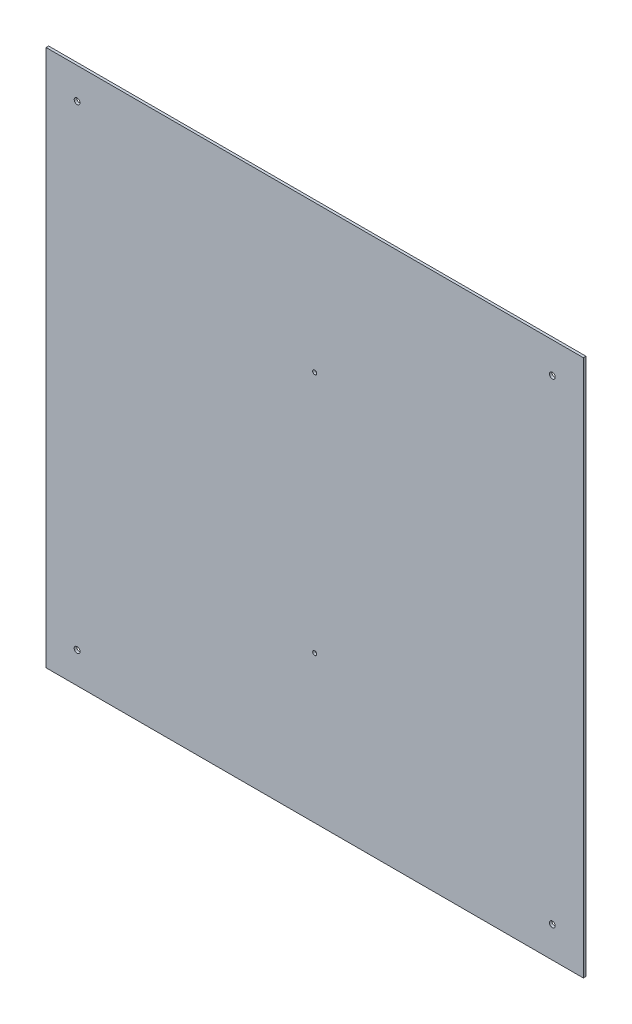
ISO-10303-21;
HEADER;
FILE_DESCRIPTION(('STEP AP214'),'2;1');
FILE_NAME('part.step','',(''),(''),'','','');
FILE_SCHEMA(('AUTOMOTIVE_DESIGN { 1 0 10303 214 1 1 1 1 }'));
ENDSEC;
DATA;
#1=APPLICATION_CONTEXT('core data for automotive mechanical design processes');
#2=APPLICATION_PROTOCOL_DEFINITION('international standard','automotive_design',2000,#1);
#3=PRODUCT_CONTEXT('',#1,'mechanical');
#4=PRODUCT('Part','Part','',(#3));
#5=PRODUCT_RELATED_PRODUCT_CATEGORY('part','',(#4));
#6=PRODUCT_DEFINITION_FORMATION('','',#4);
#7=PRODUCT_DEFINITION_CONTEXT('part definition',#1,'design');
#8=PRODUCT_DEFINITION('design','',#6,#7);
#9=PRODUCT_DEFINITION_SHAPE('','',#8);
#10=(LENGTH_UNIT() NAMED_UNIT(*) SI_UNIT(.MILLI.,.METRE.));
#11=(NAMED_UNIT(*) PLANE_ANGLE_UNIT() SI_UNIT($,.RADIAN.));
#12=(NAMED_UNIT(*) SI_UNIT($,.STERADIAN.) SOLID_ANGLE_UNIT());
#13=UNCERTAINTY_MEASURE_WITH_UNIT(LENGTH_MEASURE(1.E-05),#10,'distance_accuracy_value','');
#14=(GEOMETRIC_REPRESENTATION_CONTEXT(3) GLOBAL_UNCERTAINTY_ASSIGNED_CONTEXT((#13)) GLOBAL_UNIT_ASSIGNED_CONTEXT((#10,
#11,#12)) REPRESENTATION_CONTEXT('',''));
#15=CARTESIAN_POINT('',(0.,0.,0.));
#16=DIRECTION('',(0.,0.,1.));
#17=DIRECTION('',(1.,0.,0.));
#18=AXIS2_PLACEMENT_3D('',#15,#16,#17);
#19=CARTESIAN_POINT('',(0.,0.,3.175));
#20=DIRECTION('',(0.,0.,-1.));
#21=DIRECTION('',(-1.,0.,0.));
#22=AXIS2_PLACEMENT_3D('',#19,#20,#21);
#23=PLANE('',#22);
#24=DIRECTION('',(0.,-1.,0.));
#25=VECTOR('',#24,1.);
#26=CARTESIAN_POINT('',(0.,0.,3.175));
#27=LINE('',#26,#25);
#28=CARTESIAN_POINT('',(0.,660.4,3.175));
#29=VERTEX_POINT('',#28);
#30=CARTESIAN_POINT('',(0.,0.,3.175));
#31=VERTEX_POINT('',#30);
#32=EDGE_CURVE('E84',#29,#31,#27,.T.);
#33=ORIENTED_EDGE('',*,*,#32,.T.);
#34=DIRECTION('',(1.,0.,0.));
#35=VECTOR('',#34,1.);
#36=CARTESIAN_POINT('',(0.,0.,3.175));
#37=LINE('',#36,#35);
#38=CARTESIAN_POINT('',(660.4,0.,3.175));
#39=VERTEX_POINT('',#38);
#40=EDGE_CURVE('E79',#31,#39,#37,.T.);
#41=ORIENTED_EDGE('',*,*,#40,.T.);
#42=DIRECTION('',(0.,1.,0.));
#43=VECTOR('',#42,1.);
#44=CARTESIAN_POINT('',(660.4,0.,3.175));
#45=LINE('',#44,#43);
#46=CARTESIAN_POINT('',(660.4,660.4,3.175));
#47=VERTEX_POINT('',#46);
#48=EDGE_CURVE('E82',#39,#47,#45,.T.);
#49=ORIENTED_EDGE('',*,*,#48,.T.);
#50=DIRECTION('',(-1.,0.,0.));
#51=VECTOR('',#50,1.);
#52=CARTESIAN_POINT('',(0.,660.4,3.175));
#53=LINE('',#52,#51);
#54=EDGE_CURVE('E49',#47,#29,#53,.T.);
#55=ORIENTED_EDGE('',*,*,#54,.T.);
#56=EDGE_LOOP('',(#33,#41,#49,#55));
#57=FACE_BOUND('',#56,.T.);
#58=CARTESIAN_POINT('',(330.2,479.679,3.175));
#59=DIRECTION('',(0.,0.,1.));
#60=DIRECTION('',(1.,0.,0.));
#61=AXIS2_PLACEMENT_3D('',#58,#59,#60);
#62=CIRCLE('',#61,2.50000000000002);
#63=CARTESIAN_POINT('',(332.7,479.679,3.175));
#64=VERTEX_POINT('',#63);
#65=EDGE_CURVE('E99',#64,#64,#62,.T.);
#66=ORIENTED_EDGE('',*,*,#65,.F.);
#67=EDGE_LOOP('',(#66));
#68=FACE_BOUND('',#67,.T.);
#69=CARTESIAN_POINT('',(330.2,180.721,3.175));
#70=DIRECTION('',(0.,0.,1.));
#71=DIRECTION('',(1.,0.,0.));
#72=AXIS2_PLACEMENT_3D('',#69,#70,#71);
#73=CIRCLE('',#72,2.50000000000002);
#74=CARTESIAN_POINT('',(332.7,180.721,3.175));
#75=VERTEX_POINT('',#74);
#76=EDGE_CURVE('E114',#75,#75,#73,.T.);
#77=ORIENTED_EDGE('',*,*,#76,.F.);
#78=EDGE_LOOP('',(#77));
#79=FACE_BOUND('',#78,.T.);
#80=CARTESIAN_POINT('',(38.1,622.3,3.175));
#81=DIRECTION('',(0.,0.,1.));
#82=DIRECTION('',(1.,0.,0.));
#83=AXIS2_PLACEMENT_3D('',#80,#81,#82);
#84=CIRCLE('',#83,3.55600000000005);
#85=CARTESIAN_POINT('',(41.6560000000001,622.3,3.175));
#86=VERTEX_POINT('',#85);
#87=EDGE_CURVE('E120',#86,#86,#84,.T.);
#88=ORIENTED_EDGE('',*,*,#87,.F.);
#89=EDGE_LOOP('',(#88));
#90=FACE_BOUND('',#89,.T.);
#91=CARTESIAN_POINT('',(622.3,622.3,3.175));
#92=DIRECTION('',(0.,0.,1.));
#93=DIRECTION('',(1.,0.,0.));
#94=AXIS2_PLACEMENT_3D('',#91,#92,#93);
#95=CIRCLE('',#94,3.55599999999997);
#96=CARTESIAN_POINT('',(625.856,622.3,3.175));
#97=VERTEX_POINT('',#96);
#98=EDGE_CURVE('E126',#97,#97,#95,.T.);
#99=ORIENTED_EDGE('',*,*,#98,.F.);
#100=EDGE_LOOP('',(#99));
#101=FACE_BOUND('',#100,.T.);
#102=CARTESIAN_POINT('',(622.3,38.1,3.175));
#103=DIRECTION('',(0.,0.,1.));
#104=DIRECTION('',(1.,0.,0.));
#105=AXIS2_PLACEMENT_3D('',#102,#103,#104);
#106=CIRCLE('',#105,3.55599999999996);
#107=CARTESIAN_POINT('',(625.856,38.1,3.175));
#108=VERTEX_POINT('',#107);
#109=EDGE_CURVE('E132',#108,#108,#106,.T.);
#110=ORIENTED_EDGE('',*,*,#109,.F.);
#111=EDGE_LOOP('',(#110));
#112=FACE_BOUND('',#111,.T.);
#113=CARTESIAN_POINT('',(38.1,38.1,3.175));
#114=DIRECTION('',(0.,0.,1.));
#115=DIRECTION('',(1.,0.,0.));
#116=AXIS2_PLACEMENT_3D('',#113,#114,#115);
#117=CIRCLE('',#116,3.55600000000001);
#118=CARTESIAN_POINT('',(41.656,38.1,3.175));
#119=VERTEX_POINT('',#118);
#120=EDGE_CURVE('E138',#119,#119,#117,.T.);
#121=ORIENTED_EDGE('',*,*,#120,.F.);
#122=EDGE_LOOP('',(#121));
#123=FACE_BOUND('',#122,.T.);
#124=ADVANCED_FACE('F32',(#57,#68,#79,#90,#101,#112,#123),#23,.F.);
#125=CARTESIAN_POINT('',(0.,0.,0.));
#126=DIRECTION('',(0.,0.,-1.));
#127=DIRECTION('',(-1.,0.,0.));
#128=AXIS2_PLACEMENT_3D('',#125,#126,#127);
#129=PLANE('',#128);
#130=CARTESIAN_POINT('',(622.3,38.1,0.));
#131=DIRECTION('',(0.,0.,1.));
#132=DIRECTION('',(1.,0.,0.));
#133=AXIS2_PLACEMENT_3D('',#130,#131,#132);
#134=CIRCLE('',#133,3.55599999999996);
#135=CARTESIAN_POINT('',(625.856,38.1,0.));
#136=VERTEX_POINT('',#135);
#137=EDGE_CURVE('E135',#136,#136,#134,.T.);
#138=ORIENTED_EDGE('',*,*,#137,.T.);
#139=EDGE_LOOP('',(#138));
#140=FACE_BOUND('',#139,.T.);
#141=CARTESIAN_POINT('',(38.1,622.3,0.));
#142=DIRECTION('',(0.,0.,1.));
#143=DIRECTION('',(1.,0.,0.));
#144=AXIS2_PLACEMENT_3D('',#141,#142,#143);
#145=CIRCLE('',#144,3.55600000000005);
#146=CARTESIAN_POINT('',(41.6560000000001,622.3,0.));
#147=VERTEX_POINT('',#146);
#148=EDGE_CURVE('E123',#147,#147,#145,.T.);
#149=ORIENTED_EDGE('',*,*,#148,.T.);
#150=EDGE_LOOP('',(#149));
#151=FACE_BOUND('',#150,.T.);
#152=CARTESIAN_POINT('',(330.2,479.679,0.));
#153=DIRECTION('',(0.,0.,1.));
#154=DIRECTION('',(1.,0.,0.));
#155=AXIS2_PLACEMENT_3D('',#152,#153,#154);
#156=CIRCLE('',#155,2.50000000000002);
#157=CARTESIAN_POINT('',(332.7,479.679,0.));
#158=VERTEX_POINT('',#157);
#159=EDGE_CURVE('E111',#158,#158,#156,.T.);
#160=ORIENTED_EDGE('',*,*,#159,.T.);
#161=EDGE_LOOP('',(#160));
#162=FACE_BOUND('',#161,.T.);
#163=DIRECTION('',(0.,-1.,0.));
#164=VECTOR('',#163,1.);
#165=CARTESIAN_POINT('',(0.,0.,0.));
#166=LINE('',#165,#164);
#167=CARTESIAN_POINT('',(0.,660.4,0.));
#168=VERTEX_POINT('',#167);
#169=CARTESIAN_POINT('',(0.,0.,0.));
#170=VERTEX_POINT('',#169);
#171=EDGE_CURVE('E96',#168,#170,#166,.T.);
#172=ORIENTED_EDGE('',*,*,#171,.F.);
#173=DIRECTION('',(-1.,0.,0.));
#174=VECTOR('',#173,1.);
#175=CARTESIAN_POINT('',(0.,660.4,0.));
#176=LINE('',#175,#174);
#177=CARTESIAN_POINT('',(660.4,660.4,0.));
#178=VERTEX_POINT('',#177);
#179=EDGE_CURVE('E72',#178,#168,#176,.T.);
#180=ORIENTED_EDGE('',*,*,#179,.F.);
#181=DIRECTION('',(0.,1.,0.));
#182=VECTOR('',#181,1.);
#183=CARTESIAN_POINT('',(660.4,0.,0.));
#184=LINE('',#183,#182);
#185=CARTESIAN_POINT('',(660.4,0.,0.));
#186=VERTEX_POINT('',#185);
#187=EDGE_CURVE('E66',#186,#178,#184,.T.);
#188=ORIENTED_EDGE('',*,*,#187,.F.);
#189=DIRECTION('',(1.,0.,0.));
#190=VECTOR('',#189,1.);
#191=CARTESIAN_POINT('',(0.,0.,0.));
#192=LINE('',#191,#190);
#193=EDGE_CURVE('E88',#170,#186,#192,.T.);
#194=ORIENTED_EDGE('',*,*,#193,.F.);
#195=EDGE_LOOP('',(#172,#180,#188,#194));
#196=FACE_BOUND('',#195,.T.);
#197=CARTESIAN_POINT('',(330.2,180.721,0.));
#198=DIRECTION('',(0.,0.,1.));
#199=DIRECTION('',(1.,0.,0.));
#200=AXIS2_PLACEMENT_3D('',#197,#198,#199);
#201=CIRCLE('',#200,2.50000000000002);
#202=CARTESIAN_POINT('',(332.7,180.721,0.));
#203=VERTEX_POINT('',#202);
#204=EDGE_CURVE('E117',#203,#203,#201,.T.);
#205=ORIENTED_EDGE('',*,*,#204,.T.);
#206=EDGE_LOOP('',(#205));
#207=FACE_BOUND('',#206,.T.);
#208=CARTESIAN_POINT('',(622.3,622.3,0.));
#209=DIRECTION('',(0.,0.,1.));
#210=DIRECTION('',(1.,0.,0.));
#211=AXIS2_PLACEMENT_3D('',#208,#209,#210);
#212=CIRCLE('',#211,3.55599999999997);
#213=CARTESIAN_POINT('',(625.856,622.3,0.));
#214=VERTEX_POINT('',#213);
#215=EDGE_CURVE('E129',#214,#214,#212,.T.);
#216=ORIENTED_EDGE('',*,*,#215,.T.);
#217=EDGE_LOOP('',(#216));
#218=FACE_BOUND('',#217,.T.);
#219=CARTESIAN_POINT('',(38.1,38.1,0.));
#220=DIRECTION('',(0.,0.,1.));
#221=DIRECTION('',(1.,0.,0.));
#222=AXIS2_PLACEMENT_3D('',#219,#220,#221);
#223=CIRCLE('',#222,3.55600000000001);
#224=CARTESIAN_POINT('',(41.656,38.1,0.));
#225=VERTEX_POINT('',#224);
#226=EDGE_CURVE('E141',#225,#225,#223,.T.);
#227=ORIENTED_EDGE('',*,*,#226,.T.);
#228=EDGE_LOOP('',(#227));
#229=FACE_BOUND('',#228,.T.);
#230=ADVANCED_FACE('F107',(#140,#151,#162,#196,#207,#218,#229),#129,.T.);
#231=CARTESIAN_POINT('',(0.,0.,3.175));
#232=DIRECTION('',(1.,0.,0.));
#233=DIRECTION('',(0.,0.,-1.));
#234=AXIS2_PLACEMENT_3D('',#231,#232,#233);
#235=PLANE('',#234);
#236=ORIENTED_EDGE('',*,*,#171,.T.);
#237=DIRECTION('',(0.,0.,-1.));
#238=VECTOR('',#237,1.);
#239=CARTESIAN_POINT('',(0.,0.,3.175));
#240=LINE('',#239,#238);
#241=EDGE_CURVE('E11',#31,#170,#240,.T.);
#242=ORIENTED_EDGE('',*,*,#241,.F.);
#243=ORIENTED_EDGE('',*,*,#32,.F.);
#244=DIRECTION('',(0.,0.,-1.));
#245=VECTOR('',#244,1.);
#246=CARTESIAN_POINT('',(0.,660.4,3.175));
#247=LINE('',#246,#245);
#248=EDGE_CURVE('E92',#29,#168,#247,.T.);
#249=ORIENTED_EDGE('',*,*,#248,.T.);
#250=EDGE_LOOP('',(#236,#242,#243,#249));
#251=FACE_BOUND('',#250,.T.);
#252=ADVANCED_FACE('F34',(#251),#235,.F.);
#253=CARTESIAN_POINT('',(0.,0.,3.175));
#254=DIRECTION('',(0.,1.,0.));
#255=DIRECTION('',(0.,0.,1.));
#256=AXIS2_PLACEMENT_3D('',#253,#254,#255);
#257=PLANE('',#256);
#258=ORIENTED_EDGE('',*,*,#193,.T.);
#259=DIRECTION('',(0.,0.,-1.));
#260=VECTOR('',#259,1.);
#261=CARTESIAN_POINT('',(660.4,0.,3.175));
#262=LINE('',#261,#260);
#263=EDGE_CURVE('E41',#39,#186,#262,.T.);
#264=ORIENTED_EDGE('',*,*,#263,.F.);
#265=ORIENTED_EDGE('',*,*,#40,.F.);
#266=ORIENTED_EDGE('',*,*,#241,.T.);
#267=EDGE_LOOP('',(#258,#264,#265,#266));
#268=FACE_BOUND('',#267,.T.);
#269=ADVANCED_FACE('F87',(#268),#257,.F.);
#270=CARTESIAN_POINT('',(660.4,0.,3.175));
#271=DIRECTION('',(-1.,0.,0.));
#272=DIRECTION('',(0.,0.,1.));
#273=AXIS2_PLACEMENT_3D('',#270,#271,#272);
#274=PLANE('',#273);
#275=ORIENTED_EDGE('',*,*,#187,.T.);
#276=DIRECTION('',(0.,0.,-1.));
#277=VECTOR('',#276,1.);
#278=CARTESIAN_POINT('',(660.4,660.4,3.175));
#279=LINE('',#278,#277);
#280=EDGE_CURVE('E89',#47,#178,#279,.T.);
#281=ORIENTED_EDGE('',*,*,#280,.F.);
#282=ORIENTED_EDGE('',*,*,#48,.F.);
#283=ORIENTED_EDGE('',*,*,#263,.T.);
#284=EDGE_LOOP('',(#275,#281,#282,#283));
#285=FACE_BOUND('',#284,.T.);
#286=ADVANCED_FACE('F90',(#285),#274,.F.);
#287=CARTESIAN_POINT('',(0.,660.4,3.175));
#288=DIRECTION('',(0.,-1.,0.));
#289=DIRECTION('',(0.,0.,-1.));
#290=AXIS2_PLACEMENT_3D('',#287,#288,#289);
#291=PLANE('',#290);
#292=ORIENTED_EDGE('',*,*,#179,.T.);
#293=ORIENTED_EDGE('',*,*,#248,.F.);
#294=ORIENTED_EDGE('',*,*,#54,.F.);
#295=ORIENTED_EDGE('',*,*,#280,.T.);
#296=EDGE_LOOP('',(#292,#293,#294,#295));
#297=FACE_BOUND('',#296,.T.);
#298=ADVANCED_FACE('F104',(#297),#291,.F.);
#299=CARTESIAN_POINT('',(330.2,479.679,3.175));
#300=DIRECTION('',(0.,0.,-1.));
#301=DIRECTION('',(-1.,0.,0.));
#302=AXIS2_PLACEMENT_3D('',#299,#300,#301);
#303=CYLINDRICAL_SURFACE('',#302,2.50000000000002);
#304=ORIENTED_EDGE('',*,*,#65,.T.);
#305=EDGE_LOOP('',(#304));
#306=FACE_BOUND('',#305,.T.);
#307=ORIENTED_EDGE('',*,*,#159,.F.);
#308=EDGE_LOOP('',(#307));
#309=FACE_BOUND('',#308,.T.);
#310=ADVANCED_FACE('F158',(#306,#309),#303,.F.);
#311=CARTESIAN_POINT('',(330.2,180.721,3.175));
#312=DIRECTION('',(0.,0.,-1.));
#313=DIRECTION('',(-1.,0.,0.));
#314=AXIS2_PLACEMENT_3D('',#311,#312,#313);
#315=CYLINDRICAL_SURFACE('',#314,2.50000000000002);
#316=ORIENTED_EDGE('',*,*,#76,.T.);
#317=EDGE_LOOP('',(#316));
#318=FACE_BOUND('',#317,.T.);
#319=ORIENTED_EDGE('',*,*,#204,.F.);
#320=EDGE_LOOP('',(#319));
#321=FACE_BOUND('',#320,.T.);
#322=ADVANCED_FACE('F204',(#318,#321),#315,.F.);
#323=CARTESIAN_POINT('',(38.1,622.3,3.175));
#324=DIRECTION('',(0.,0.,-1.));
#325=DIRECTION('',(-1.,0.,0.));
#326=AXIS2_PLACEMENT_3D('',#323,#324,#325);
#327=CYLINDRICAL_SURFACE('',#326,3.55600000000005);
#328=ORIENTED_EDGE('',*,*,#87,.T.);
#329=EDGE_LOOP('',(#328));
#330=FACE_BOUND('',#329,.T.);
#331=ORIENTED_EDGE('',*,*,#148,.F.);
#332=EDGE_LOOP('',(#331));
#333=FACE_BOUND('',#332,.T.);
#334=ADVANCED_FACE('F212',(#330,#333),#327,.F.);
#335=CARTESIAN_POINT('',(622.3,622.3,3.175));
#336=DIRECTION('',(0.,0.,-1.));
#337=DIRECTION('',(-1.,0.,0.));
#338=AXIS2_PLACEMENT_3D('',#335,#336,#337);
#339=CYLINDRICAL_SURFACE('',#338,3.55599999999997);
#340=ORIENTED_EDGE('',*,*,#98,.T.);
#341=EDGE_LOOP('',(#340));
#342=FACE_BOUND('',#341,.T.);
#343=ORIENTED_EDGE('',*,*,#215,.F.);
#344=EDGE_LOOP('',(#343));
#345=FACE_BOUND('',#344,.T.);
#346=ADVANCED_FACE('F220',(#342,#345),#339,.F.);
#347=CARTESIAN_POINT('',(622.3,38.1,3.175));
#348=DIRECTION('',(0.,0.,-1.));
#349=DIRECTION('',(-1.,0.,0.));
#350=AXIS2_PLACEMENT_3D('',#347,#348,#349);
#351=CYLINDRICAL_SURFACE('',#350,3.55599999999996);
#352=ORIENTED_EDGE('',*,*,#109,.T.);
#353=EDGE_LOOP('',(#352));
#354=FACE_BOUND('',#353,.T.);
#355=ORIENTED_EDGE('',*,*,#137,.F.);
#356=EDGE_LOOP('',(#355));
#357=FACE_BOUND('',#356,.T.);
#358=ADVANCED_FACE('F229',(#354,#357),#351,.F.);
#359=CARTESIAN_POINT('',(38.1,38.1,3.175));
#360=DIRECTION('',(0.,0.,-1.));
#361=DIRECTION('',(-1.,0.,0.));
#362=AXIS2_PLACEMENT_3D('',#359,#360,#361);
#363=CYLINDRICAL_SURFACE('',#362,3.55600000000001);
#364=ORIENTED_EDGE('',*,*,#120,.T.);
#365=EDGE_LOOP('',(#364));
#366=FACE_BOUND('',#365,.T.);
#367=ORIENTED_EDGE('',*,*,#226,.F.);
#368=EDGE_LOOP('',(#367));
#369=FACE_BOUND('',#368,.T.);
#370=ADVANCED_FACE('F147',(#366,#369),#363,.F.);
#371=CLOSED_SHELL('',(#124,#230,#252,#269,#286,#298,#310,#322,#334,#346,#358,#370));
#372=MANIFOLD_SOLID_BREP('B2',#371);
#373=ADVANCED_BREP_SHAPE_REPRESENTATION('',(#18,#372),#14);
#374=SHAPE_DEFINITION_REPRESENTATION(#9,#373);
ENDSEC;
END-ISO-10303-21;
